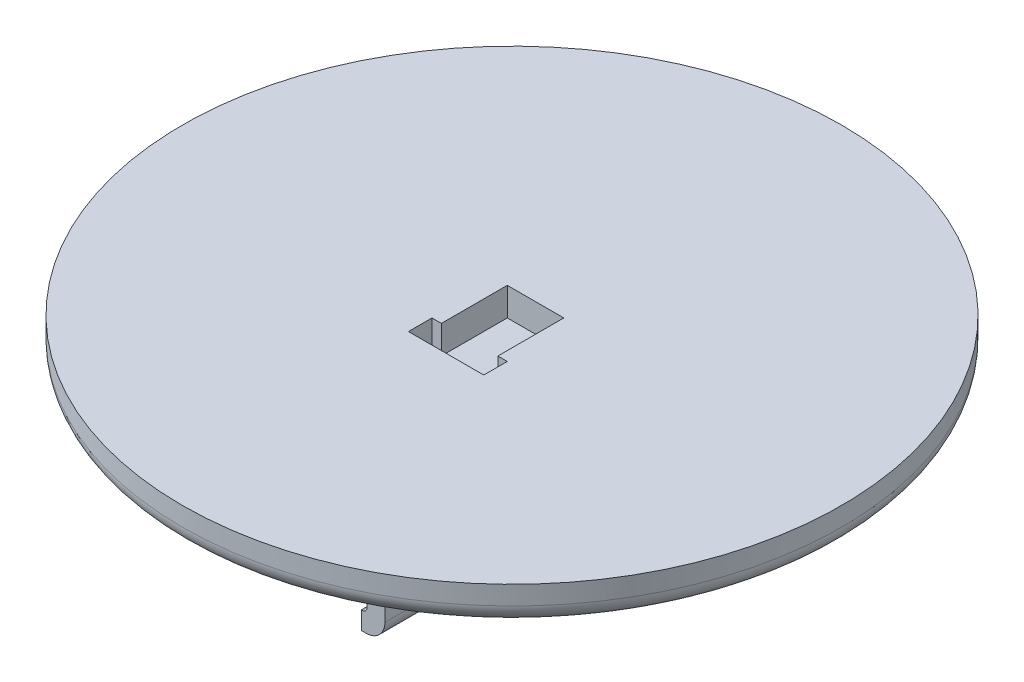
ISO-10303-21;
HEADER;
FILE_DESCRIPTION(('STEP AP214'),'2;1');
FILE_NAME('part.step','',(''),(''),'','','');
FILE_SCHEMA(('AUTOMOTIVE_DESIGN { 1 0 10303 214 1 1 1 1 }'));
ENDSEC;
DATA;
#1=APPLICATION_CONTEXT('core data for automotive mechanical design processes');
#2=APPLICATION_PROTOCOL_DEFINITION('international standard','automotive_design',2000,#1);
#3=PRODUCT_CONTEXT('',#1,'mechanical');
#4=PRODUCT('Part','Part','',(#3));
#5=PRODUCT_RELATED_PRODUCT_CATEGORY('part','',(#4));
#6=PRODUCT_DEFINITION_FORMATION('','',#4);
#7=PRODUCT_DEFINITION_CONTEXT('part definition',#1,'design');
#8=PRODUCT_DEFINITION('design','',#6,#7);
#9=PRODUCT_DEFINITION_SHAPE('','',#8);
#10=(LENGTH_UNIT() NAMED_UNIT(*) SI_UNIT(.MILLI.,.METRE.));
#11=(NAMED_UNIT(*) PLANE_ANGLE_UNIT() SI_UNIT($,.RADIAN.));
#12=(NAMED_UNIT(*) SI_UNIT($,.STERADIAN.) SOLID_ANGLE_UNIT());
#13=UNCERTAINTY_MEASURE_WITH_UNIT(LENGTH_MEASURE(1.E-05),#10,'distance_accuracy_value','');
#14=(GEOMETRIC_REPRESENTATION_CONTEXT(3) GLOBAL_UNCERTAINTY_ASSIGNED_CONTEXT((#13)) GLOBAL_UNIT_ASSIGNED_CONTEXT((#10,
#11,#12)) REPRESENTATION_CONTEXT('',''));
#15=CARTESIAN_POINT('',(0.,0.,0.));
#16=DIRECTION('',(0.,0.,1.));
#17=DIRECTION('',(1.,0.,0.));
#18=AXIS2_PLACEMENT_3D('',#15,#16,#17);
#19=CARTESIAN_POINT('',(-7.5,-12.,21.));
#20=DIRECTION('',(0.,0.,-1.));
#21=DIRECTION('',(-1.,0.,0.));
#22=AXIS2_PLACEMENT_3D('',#19,#20,#21);
#23=PLANE('',#22);
#24=DIRECTION('',(-1.,0.,0.));
#25=VECTOR('',#24,1.);
#26=CARTESIAN_POINT('',(-7.5,-12.,21.));
#27=LINE('',#26,#25);
#28=CARTESIAN_POINT('',(-5.,-12.,21.));
#29=VERTEX_POINT('',#28);
#30=CARTESIAN_POINT('',(-5.5,-12.,21.));
#31=VERTEX_POINT('',#30);
#32=EDGE_CURVE('E238',#29,#31,#27,.T.);
#33=ORIENTED_EDGE('',*,*,#32,.F.);
#34=DIRECTION('',(0.,-1.,0.));
#35=VECTOR('',#34,1.);
#36=CARTESIAN_POINT('',(-5.,-10.1,21.));
#37=LINE('',#36,#35);
#38=CARTESIAN_POINT('',(-5.,-10.1,21.));
#39=VERTEX_POINT('',#38);
#40=EDGE_CURVE('E225',#39,#29,#37,.T.);
#41=ORIENTED_EDGE('',*,*,#40,.F.);
#42=DIRECTION('',(1.,0.,0.));
#43=VECTOR('',#42,1.);
#44=CARTESIAN_POINT('',(-5.6,-10.1,21.));
#45=LINE('',#44,#43);
#46=CARTESIAN_POINT('',(-5.1,-10.1,21.));
#47=VERTEX_POINT('',#46);
#48=EDGE_CURVE('E451',#47,#39,#45,.T.);
#49=ORIENTED_EDGE('',*,*,#48,.F.);
#50=CARTESIAN_POINT('',(-5.1,-9.6,21.));
#51=DIRECTION('',(0.,0.,-1.));
#52=DIRECTION('',(-1.,0.,0.));
#53=AXIS2_PLACEMENT_3D('',#50,#51,#52);
#54=CIRCLE('',#53,0.5);
#55=CARTESIAN_POINT('',(-5.6,-9.6,21.));
#56=VERTEX_POINT('',#55);
#57=EDGE_CURVE('E12',#47,#56,#54,.T.);
#58=ORIENTED_EDGE('',*,*,#57,.T.);
#59=DIRECTION('',(0.,-1.,0.));
#60=VECTOR('',#59,1.);
#61=CARTESIAN_POINT('',(-5.6,0.,21.));
#62=LINE('',#61,#60);
#63=CARTESIAN_POINT('',(-5.6,0.,21.));
#64=VERTEX_POINT('',#63);
#65=EDGE_CURVE('E422',#64,#56,#62,.T.);
#66=ORIENTED_EDGE('',*,*,#65,.F.);
#67=DIRECTION('',(-1.,0.,0.));
#68=VECTOR('',#67,1.);
#69=CARTESIAN_POINT('',(-7.5,0.,21.));
#70=LINE('',#69,#68);
#71=CARTESIAN_POINT('',(-9.5,0.,21.));
#72=VERTEX_POINT('',#71);
#73=EDGE_CURVE('E254',#64,#72,#70,.T.);
#74=ORIENTED_EDGE('',*,*,#73,.T.);
#75=CARTESIAN_POINT('',(-9.5,-2.,21.));
#76=DIRECTION('',(0.,0.,-1.));
#77=DIRECTION('',(-1.,0.,0.));
#78=AXIS2_PLACEMENT_3D('',#75,#76,#77);
#79=CIRCLE('',#78,2.);
#80=CARTESIAN_POINT('',(-7.5,-2.,21.));
#81=VERTEX_POINT('',#80);
#82=EDGE_CURVE('E381',#72,#81,#79,.T.);
#83=ORIENTED_EDGE('',*,*,#82,.T.);
#84=DIRECTION('',(0.,1.,0.));
#85=VECTOR('',#84,1.);
#86=CARTESIAN_POINT('',(-7.5,-12.,21.));
#87=LINE('',#86,#85);
#88=CARTESIAN_POINT('',(-7.5,-10.,21.));
#89=VERTEX_POINT('',#88);
#90=EDGE_CURVE('E252',#89,#81,#87,.T.);
#91=ORIENTED_EDGE('',*,*,#90,.F.);
#92=CARTESIAN_POINT('',(-5.5,-10.,21.));
#93=DIRECTION('',(0.,0.,-1.));
#94=DIRECTION('',(-1.,0.,0.));
#95=AXIS2_PLACEMENT_3D('',#92,#93,#94);
#96=CIRCLE('',#95,2.);
#97=EDGE_CURVE('E246',#89,#31,#96,.F.);
#98=ORIENTED_EDGE('',*,*,#97,.T.);
#99=EDGE_LOOP('',(#33,#41,#49,#58,#66,#74,#83,#91,#98));
#100=FACE_BOUND('',#99,.T.);
#101=ADVANCED_FACE('F35',(#100),#23,.F.);
#102=CARTESIAN_POINT('',(0.,-12.,0.));
#103=DIRECTION('',(0.,-1.,0.));
#104=DIRECTION('',(0.,0.,-1.));
#105=AXIS2_PLACEMENT_3D('',#102,#103,#104);
#106=PLANE('',#105);
#107=DIRECTION('',(0.,0.,1.));
#108=VECTOR('',#107,1.);
#109=CARTESIAN_POINT('',(-5.,-12.,-11.1788997440784));
#110=LINE('',#109,#108);
#111=CARTESIAN_POINT('',(-5.,-12.,-1.));
#112=VERTEX_POINT('',#111);
#113=EDGE_CURVE('E228',#112,#29,#110,.T.);
#114=ORIENTED_EDGE('',*,*,#113,.T.);
#115=ORIENTED_EDGE('',*,*,#32,.T.);
#116=DIRECTION('',(0.,0.,-1.));
#117=VECTOR('',#116,1.);
#118=CARTESIAN_POINT('',(-5.5,-12.,-3.));
#119=LINE('',#118,#117);
#120=CARTESIAN_POINT('',(-5.5,-12.,-1.));
#121=VERTEX_POINT('',#120);
#122=EDGE_CURVE('E372',#31,#121,#119,.T.);
#123=ORIENTED_EDGE('',*,*,#122,.T.);
#124=DIRECTION('',(1.,0.,0.));
#125=VECTOR('',#124,1.);
#126=CARTESIAN_POINT('',(7.5,-12.,-0.999999999999998));
#127=LINE('',#126,#125);
#128=EDGE_CURVE('E241',#121,#112,#127,.T.);
#129=ORIENTED_EDGE('',*,*,#128,.T.);
#130=EDGE_LOOP('',(#114,#115,#123,#129));
#131=FACE_BOUND('',#130,.T.);
#132=ADVANCED_FACE('F237',(#131),#106,.T.);
#133=CARTESIAN_POINT('',(-5.6,-10.1,-18.0814455540575));
#134=DIRECTION('',(0.,-1.,0.));
#135=DIRECTION('',(0.,0.,-1.));
#136=AXIS2_PLACEMENT_3D('',#133,#134,#135);
#137=PLANE('',#136);
#138=DIRECTION('',(-1.,0.,0.));
#139=VECTOR('',#138,1.);
#140=CARTESIAN_POINT('',(-5.6,-10.1,-1.));
#141=LINE('',#140,#139);
#142=CARTESIAN_POINT('',(-5.,-10.1,-1.));
#143=VERTEX_POINT('',#142);
#144=CARTESIAN_POINT('',(-5.1,-10.1,-1.));
#145=VERTEX_POINT('',#144);
#146=EDGE_CURVE('E476',#143,#145,#141,.T.);
#147=ORIENTED_EDGE('',*,*,#146,.T.);
#148=DIRECTION('',(0.,0.,1.));
#149=VECTOR('',#148,1.);
#150=CARTESIAN_POINT('',(-5.1,-10.1,21.));
#151=LINE('',#150,#149);
#152=EDGE_CURVE('E431',#145,#47,#151,.T.);
#153=ORIENTED_EDGE('',*,*,#152,.T.);
#154=ORIENTED_EDGE('',*,*,#48,.T.);
#155=DIRECTION('',(0.,0.,1.));
#156=VECTOR('',#155,1.);
#157=CARTESIAN_POINT('',(-5.,-10.1,-11.1788997440784));
#158=LINE('',#157,#156);
#159=EDGE_CURVE('E231',#143,#39,#158,.T.);
#160=ORIENTED_EDGE('',*,*,#159,.F.);
#161=EDGE_LOOP('',(#147,#153,#154,#160));
#162=FACE_BOUND('',#161,.T.);
#163=ADVANCED_FACE('F572',(#162),#137,.F.);
#164=CARTESIAN_POINT('',(0.,0.,0.));
#165=DIRECTION('',(0.,1.,0.));
#166=DIRECTION('',(0.,0.,1.));
#167=AXIS2_PLACEMENT_3D('',#164,#165,#166);
#168=PLANE('',#167);
#169=CARTESIAN_POINT('',(0.,0.,0.));
#170=DIRECTION('',(0.,1.,0.));
#171=DIRECTION('',(0.,0.,1.));
#172=AXIS2_PLACEMENT_3D('',#169,#170,#171);
#173=CIRCLE('',#172,33.);
#174=CARTESIAN_POINT('',(0.,0.,33.));
#175=VERTEX_POINT('',#174);
#176=EDGE_CURVE('E334',#175,#175,#173,.F.);
#177=ORIENTED_EDGE('',*,*,#176,.T.);
#178=EDGE_LOOP('',(#177));
#179=FACE_BOUND('',#178,.T.);
#180=DIRECTION('',(0.,0.,-1.));
#181=VECTOR('',#180,1.);
#182=CARTESIAN_POINT('',(-9.5,0.,21.));
#183=LINE('',#182,#181);
#184=CARTESIAN_POINT('',(-9.5,0.,-1.));
#185=VERTEX_POINT('',#184);
#186=EDGE_CURVE('E354',#185,#72,#183,.F.);
#187=ORIENTED_EDGE('',*,*,#186,.T.);
#188=ORIENTED_EDGE('',*,*,#73,.F.);
#189=DIRECTION('',(0.,0.,1.));
#190=VECTOR('',#189,1.);
#191=CARTESIAN_POINT('',(-5.6,0.,-18.0814455540575));
#192=LINE('',#191,#190);
#193=CARTESIAN_POINT('',(-5.6,0.,-1.));
#194=VERTEX_POINT('',#193);
#195=EDGE_CURVE('E468',#194,#64,#192,.T.);
#196=ORIENTED_EDGE('',*,*,#195,.F.);
#197=DIRECTION('',(1.,0.,0.));
#198=VECTOR('',#197,1.);
#199=CARTESIAN_POINT('',(-5.6,0.,-1.));
#200=LINE('',#199,#198);
#201=CARTESIAN_POINT('',(5.59999999999999,0.,-1.));
#202=VERTEX_POINT('',#201);
#203=EDGE_CURVE('E467',#194,#202,#200,.T.);
#204=ORIENTED_EDGE('',*,*,#203,.T.);
#205=DIRECTION('',(0.,0.,1.));
#206=VECTOR('',#205,1.);
#207=CARTESIAN_POINT('',(5.59999999999999,0.,-18.0814455540575));
#208=LINE('',#207,#206);
#209=CARTESIAN_POINT('',(5.59999999999999,0.,21.));
#210=VERTEX_POINT('',#209);
#211=EDGE_CURVE('E466',#202,#210,#208,.T.);
#212=ORIENTED_EDGE('',*,*,#211,.T.);
#213=CARTESIAN_POINT('',(9.5,0.,21.));
#214=VERTEX_POINT('',#213);
#215=EDGE_CURVE('E249',#214,#210,#70,.T.);
#216=ORIENTED_EDGE('',*,*,#215,.F.);
#217=DIRECTION('',(0.,0.,1.));
#218=VECTOR('',#217,1.);
#219=CARTESIAN_POINT('',(9.5,0.,-3.));
#220=LINE('',#219,#218);
#221=CARTESIAN_POINT('',(9.5,0.,-1.));
#222=VERTEX_POINT('',#221);
#223=EDGE_CURVE('E352',#214,#222,#220,.F.);
#224=ORIENTED_EDGE('',*,*,#223,.T.);
#225=CARTESIAN_POINT('',(5.5,0.,-1.));
#226=DIRECTION('',(0.,1.,0.));
#227=DIRECTION('',(0.,0.,1.));
#228=AXIS2_PLACEMENT_3D('',#225,#226,#227);
#229=CIRCLE('',#228,4.);
#230=CARTESIAN_POINT('',(5.5,0.,-5.));
#231=VERTEX_POINT('',#230);
#232=EDGE_CURVE('E349',#231,#222,#229,.F.);
#233=ORIENTED_EDGE('',*,*,#232,.F.);
#234=DIRECTION('',(1.,0.,0.));
#235=VECTOR('',#234,1.);
#236=CARTESIAN_POINT('',(-7.5,0.,-5.));
#237=LINE('',#236,#235);
#238=CARTESIAN_POINT('',(-5.5,0.,-5.));
#239=VERTEX_POINT('',#238);
#240=EDGE_CURVE('E347',#231,#239,#237,.F.);
#241=ORIENTED_EDGE('',*,*,#240,.T.);
#242=CARTESIAN_POINT('',(-5.5,0.,-1.));
#243=DIRECTION('',(0.,1.,0.));
#244=DIRECTION('',(0.,0.,1.));
#245=AXIS2_PLACEMENT_3D('',#242,#243,#244);
#246=CIRCLE('',#245,4.);
#247=EDGE_CURVE('E344',#185,#239,#246,.F.);
#248=ORIENTED_EDGE('',*,*,#247,.F.);
#249=EDGE_LOOP('',(#187,#188,#196,#204,#212,#216,#224,#233,#241,#248));
#250=FACE_BOUND('',#249,.T.);
#251=DIRECTION('',(0.,0.,-1.));
#252=VECTOR('',#251,1.);
#253=CARTESIAN_POINT('',(-4.,0.,4.5));
#254=LINE('',#253,#252);
#255=CARTESIAN_POINT('',(-4.,0.,7.));
#256=VERTEX_POINT('',#255);
#257=CARTESIAN_POINT('',(-4.,0.,4.5));
#258=VERTEX_POINT('',#257);
#259=EDGE_CURVE('E273',#256,#258,#254,.T.);
#260=ORIENTED_EDGE('',*,*,#259,.F.);
#261=DIRECTION('',(-1.,0.,0.));
#262=VECTOR('',#261,1.);
#263=CARTESIAN_POINT('',(-4.,0.,7.));
#264=LINE('',#263,#262);
#265=CARTESIAN_POINT('',(4.,0.,7.));
#266=VERTEX_POINT('',#265);
#267=EDGE_CURVE('E276',#266,#256,#264,.T.);
#268=ORIENTED_EDGE('',*,*,#267,.F.);
#269=DIRECTION('',(0.,0.,1.));
#270=VECTOR('',#269,1.);
#271=CARTESIAN_POINT('',(4.,0.,4.5));
#272=LINE('',#271,#270);
#273=CARTESIAN_POINT('',(4.,0.,4.5));
#274=VERTEX_POINT('',#273);
#275=EDGE_CURVE('E266',#274,#266,#272,.T.);
#276=ORIENTED_EDGE('',*,*,#275,.F.);
#277=DIRECTION('',(1.,0.,0.));
#278=VECTOR('',#277,1.);
#279=CARTESIAN_POINT('',(-4.,0.,4.5));
#280=LINE('',#279,#278);
#281=EDGE_CURVE('E269',#258,#274,#280,.T.);
#282=ORIENTED_EDGE('',*,*,#281,.F.);
#283=EDGE_LOOP('',(#260,#268,#276,#282));
#284=FACE_BOUND('',#283,.T.);
#285=ADVANCED_FACE('F479',(#179,#250,#284),#168,.F.);
#286=CARTESIAN_POINT('',(0.,4.,0.));
#287=DIRECTION('',(0.,-1.,0.));
#288=DIRECTION('',(0.,0.,-1.));
#289=AXIS2_PLACEMENT_3D('',#286,#287,#288);
#290=CYLINDRICAL_SURFACE('',#289,35.);
#291=CARTESIAN_POINT('',(0.,2.,0.));
#292=DIRECTION('',(0.,1.,0.));
#293=DIRECTION('',(0.,0.,1.));
#294=AXIS2_PLACEMENT_3D('',#291,#292,#293);
#295=CIRCLE('',#294,35.);
#296=CARTESIAN_POINT('',(0.,2.,35.));
#297=VERTEX_POINT('',#296);
#298=EDGE_CURVE('E331',#297,#297,#295,.T.);
#299=ORIENTED_EDGE('',*,*,#298,.T.);
#300=EDGE_LOOP('',(#299));
#301=FACE_BOUND('',#300,.T.);
#302=CARTESIAN_POINT('',(0.,4.,0.));
#303=DIRECTION('',(0.,1.,0.));
#304=DIRECTION('',(0.,0.,1.));
#305=AXIS2_PLACEMENT_3D('',#302,#303,#304);
#306=CIRCLE('',#305,35.);
#307=CARTESIAN_POINT('',(0.,4.,35.));
#308=VERTEX_POINT('',#307);
#309=EDGE_CURVE('E322',#308,#308,#306,.T.);
#310=ORIENTED_EDGE('',*,*,#309,.F.);
#311=EDGE_LOOP('',(#310));
#312=FACE_BOUND('',#311,.T.);
#313=ADVANCED_FACE('F626',(#301,#312),#290,.T.);
#314=CARTESIAN_POINT('',(0.,4.,0.));
#315=DIRECTION('',(0.,1.,0.));
#316=DIRECTION('',(0.,0.,1.));
#317=AXIS2_PLACEMENT_3D('',#314,#315,#316);
#318=PLANE('',#317);
#319=DIRECTION('',(-1.,0.,0.));
#320=VECTOR('',#319,1.);
#321=CARTESIAN_POINT('',(-4.,4.,4.5));
#322=LINE('',#321,#320);
#323=CARTESIAN_POINT('',(-3.,4.,4.5));
#324=VERTEX_POINT('',#323);
#325=CARTESIAN_POINT('',(-4.,4.,4.5));
#326=VERTEX_POINT('',#325);
#327=EDGE_CURVE('E285',#324,#326,#322,.T.);
#328=ORIENTED_EDGE('',*,*,#327,.F.);
#329=DIRECTION('',(0.,0.,1.));
#330=VECTOR('',#329,1.);
#331=CARTESIAN_POINT('',(-3.,4.,-2.5));
#332=LINE('',#331,#330);
#333=CARTESIAN_POINT('',(-3.,4.,-2.5));
#334=VERTEX_POINT('',#333);
#335=EDGE_CURVE('E298',#334,#324,#332,.T.);
#336=ORIENTED_EDGE('',*,*,#335,.F.);
#337=DIRECTION('',(-1.,0.,0.));
#338=VECTOR('',#337,1.);
#339=CARTESIAN_POINT('',(-3.,4.,-2.5));
#340=LINE('',#339,#338);
#341=CARTESIAN_POINT('',(3.,4.,-2.5));
#342=VERTEX_POINT('',#341);
#343=EDGE_CURVE('E303',#342,#334,#340,.T.);
#344=ORIENTED_EDGE('',*,*,#343,.F.);
#345=DIRECTION('',(0.,0.,-1.));
#346=VECTOR('',#345,1.);
#347=CARTESIAN_POINT('',(3.,4.,-2.5));
#348=LINE('',#347,#346);
#349=CARTESIAN_POINT('',(3.,4.,4.5));
#350=VERTEX_POINT('',#349);
#351=EDGE_CURVE('E315',#350,#342,#348,.T.);
#352=ORIENTED_EDGE('',*,*,#351,.F.);
#353=CARTESIAN_POINT('',(4.,4.,4.5));
#354=VERTEX_POINT('',#353);
#355=EDGE_CURVE('E286',#354,#350,#322,.T.);
#356=ORIENTED_EDGE('',*,*,#355,.F.);
#357=DIRECTION('',(0.,0.,-1.));
#358=VECTOR('',#357,1.);
#359=CARTESIAN_POINT('',(4.,4.,4.5));
#360=LINE('',#359,#358);
#361=CARTESIAN_POINT('',(4.,4.,7.));
#362=VERTEX_POINT('',#361);
#363=EDGE_CURVE('E282',#362,#354,#360,.T.);
#364=ORIENTED_EDGE('',*,*,#363,.F.);
#365=DIRECTION('',(1.,0.,0.));
#366=VECTOR('',#365,1.);
#367=CARTESIAN_POINT('',(-4.,4.,7.));
#368=LINE('',#367,#366);
#369=CARTESIAN_POINT('',(-4.,4.,7.));
#370=VERTEX_POINT('',#369);
#371=EDGE_CURVE('E279',#370,#362,#368,.T.);
#372=ORIENTED_EDGE('',*,*,#371,.F.);
#373=DIRECTION('',(0.,0.,1.));
#374=VECTOR('',#373,1.);
#375=CARTESIAN_POINT('',(-4.,4.,4.5));
#376=LINE('',#375,#374);
#377=EDGE_CURVE('E265',#326,#370,#376,.T.);
#378=ORIENTED_EDGE('',*,*,#377,.F.);
#379=EDGE_LOOP('',(#328,#336,#344,#352,#356,#364,#372,#378));
#380=FACE_BOUND('',#379,.T.);
#381=ORIENTED_EDGE('',*,*,#309,.T.);
#382=EDGE_LOOP('',(#381));
#383=FACE_BOUND('',#382,.T.);
#384=ADVANCED_FACE('F624',(#380,#383),#318,.T.);
#385=CARTESIAN_POINT('',(0.,2.,0.));
#386=DIRECTION('',(0.,1.,0.));
#387=DIRECTION('',(0.,0.,1.));
#388=AXIS2_PLACEMENT_3D('',#385,#386,#387);
#389=TOROIDAL_SURFACE('',#388,33.,2.);
#390=ORIENTED_EDGE('',*,*,#176,.F.);
#391=EDGE_LOOP('',(#390));
#392=FACE_BOUND('',#391,.T.);
#393=ORIENTED_EDGE('',*,*,#298,.F.);
#394=EDGE_LOOP('',(#393));
#395=FACE_BOUND('',#394,.T.);
#396=ADVANCED_FACE('F620',(#392,#395),#389,.T.);
#397=CARTESIAN_POINT('',(-3.,1.,-2.5));
#398=DIRECTION('',(-1.,0.,0.));
#399=DIRECTION('',(0.,0.,1.));
#400=AXIS2_PLACEMENT_3D('',#397,#398,#399);
#401=PLANE('',#400);
#402=ORIENTED_EDGE('',*,*,#335,.T.);
#403=DIRECTION('',(0.,1.,0.));
#404=VECTOR('',#403,1.);
#405=CARTESIAN_POINT('',(-3.,1.,4.5));
#406=LINE('',#405,#404);
#407=CARTESIAN_POINT('',(-3.,1.,4.5));
#408=VERTEX_POINT('',#407);
#409=EDGE_CURVE('E312',#408,#324,#406,.T.);
#410=ORIENTED_EDGE('',*,*,#409,.F.);
#411=DIRECTION('',(0.,0.,1.));
#412=VECTOR('',#411,1.);
#413=CARTESIAN_POINT('',(-3.,1.,-2.5));
#414=LINE('',#413,#412);
#415=CARTESIAN_POINT('',(-3.,1.,-2.5));
#416=VERTEX_POINT('',#415);
#417=EDGE_CURVE('E299',#416,#408,#414,.T.);
#418=ORIENTED_EDGE('',*,*,#417,.F.);
#419=DIRECTION('',(0.,1.,0.));
#420=VECTOR('',#419,1.);
#421=CARTESIAN_POINT('',(-3.,1.,-2.5));
#422=LINE('',#421,#420);
#423=EDGE_CURVE('E320',#416,#334,#422,.T.);
#424=ORIENTED_EDGE('',*,*,#423,.T.);
#425=EDGE_LOOP('',(#402,#410,#418,#424));
#426=FACE_BOUND('',#425,.T.);
#427=ADVANCED_FACE('F623',(#426),#401,.F.);
#428=CARTESIAN_POINT('',(-3.,1.,-2.5));
#429=DIRECTION('',(0.,0.,-1.));
#430=DIRECTION('',(-1.,0.,0.));
#431=AXIS2_PLACEMENT_3D('',#428,#429,#430);
#432=PLANE('',#431);
#433=ORIENTED_EDGE('',*,*,#343,.T.);
#434=ORIENTED_EDGE('',*,*,#423,.F.);
#435=DIRECTION('',(-1.,0.,0.));
#436=VECTOR('',#435,1.);
#437=CARTESIAN_POINT('',(-3.,1.,-2.5));
#438=LINE('',#437,#436);
#439=CARTESIAN_POINT('',(3.,1.,-2.5));
#440=VERTEX_POINT('',#439);
#441=EDGE_CURVE('E309',#440,#416,#438,.T.);
#442=ORIENTED_EDGE('',*,*,#441,.F.);
#443=DIRECTION('',(0.,1.,0.));
#444=VECTOR('',#443,1.);
#445=CARTESIAN_POINT('',(3.,1.,-2.5));
#446=LINE('',#445,#444);
#447=EDGE_CURVE('E323',#440,#342,#446,.T.);
#448=ORIENTED_EDGE('',*,*,#447,.T.);
#449=EDGE_LOOP('',(#433,#434,#442,#448));
#450=FACE_BOUND('',#449,.T.);
#451=ADVANCED_FACE('F638',(#450),#432,.F.);
#452=CARTESIAN_POINT('',(3.,1.,-2.5));
#453=DIRECTION('',(1.,0.,0.));
#454=DIRECTION('',(0.,0.,-1.));
#455=AXIS2_PLACEMENT_3D('',#452,#453,#454);
#456=PLANE('',#455);
#457=ORIENTED_EDGE('',*,*,#351,.T.);
#458=ORIENTED_EDGE('',*,*,#447,.F.);
#459=DIRECTION('',(0.,0.,-1.));
#460=VECTOR('',#459,1.);
#461=CARTESIAN_POINT('',(3.,1.,-2.5));
#462=LINE('',#461,#460);
#463=CARTESIAN_POINT('',(3.,1.,4.5));
#464=VERTEX_POINT('',#463);
#465=EDGE_CURVE('E306',#464,#440,#462,.T.);
#466=ORIENTED_EDGE('',*,*,#465,.F.);
#467=DIRECTION('',(0.,1.,0.));
#468=VECTOR('',#467,1.);
#469=CARTESIAN_POINT('',(3.,1.,4.5));
#470=LINE('',#469,#468);
#471=EDGE_CURVE('E325',#464,#350,#470,.T.);
#472=ORIENTED_EDGE('',*,*,#471,.T.);
#473=EDGE_LOOP('',(#457,#458,#466,#472));
#474=FACE_BOUND('',#473,.T.);
#475=ADVANCED_FACE('F640',(#474),#456,.F.);
#476=CARTESIAN_POINT('',(0.,1.,0.));
#477=DIRECTION('',(0.,1.,0.));
#478=DIRECTION('',(0.,0.,1.));
#479=AXIS2_PLACEMENT_3D('',#476,#477,#478);
#480=PLANE('',#479);
#481=ORIENTED_EDGE('',*,*,#417,.T.);
#482=DIRECTION('',(1.,0.,0.));
#483=VECTOR('',#482,1.);
#484=CARTESIAN_POINT('',(-3.,1.,4.5));
#485=LINE('',#484,#483);
#486=EDGE_CURVE('E302',#408,#464,#485,.T.);
#487=ORIENTED_EDGE('',*,*,#486,.T.);
#488=ORIENTED_EDGE('',*,*,#465,.T.);
#489=ORIENTED_EDGE('',*,*,#441,.T.);
#490=EDGE_LOOP('',(#481,#487,#488,#489));
#491=FACE_BOUND('',#490,.T.);
#492=ADVANCED_FACE('F643',(#491),#480,.T.);
#493=CARTESIAN_POINT('',(-4.,-8.38152730712011,4.5));
#494=DIRECTION('',(0.,0.,-1.));
#495=DIRECTION('',(-1.,0.,0.));
#496=AXIS2_PLACEMENT_3D('',#493,#494,#495);
#497=PLANE('',#496);
#498=ORIENTED_EDGE('',*,*,#327,.T.);
#499=DIRECTION('',(0.,1.,0.));
#500=VECTOR('',#499,1.);
#501=CARTESIAN_POINT('',(-4.,-8.38152730712011,4.5));
#502=LINE('',#501,#500);
#503=EDGE_CURVE('E270',#258,#326,#502,.T.);
#504=ORIENTED_EDGE('',*,*,#503,.F.);
#505=ORIENTED_EDGE('',*,*,#281,.T.);
#506=DIRECTION('',(0.,1.,0.));
#507=VECTOR('',#506,1.);
#508=CARTESIAN_POINT('',(4.,-8.38152730712011,4.5));
#509=LINE('',#508,#507);
#510=EDGE_CURVE('E291',#274,#354,#509,.T.);
#511=ORIENTED_EDGE('',*,*,#510,.T.);
#512=ORIENTED_EDGE('',*,*,#355,.T.);
#513=ORIENTED_EDGE('',*,*,#471,.F.);
#514=ORIENTED_EDGE('',*,*,#486,.F.);
#515=ORIENTED_EDGE('',*,*,#409,.T.);
#516=EDGE_LOOP('',(#498,#504,#505,#511,#512,#513,#514,#515));
#517=FACE_BOUND('',#516,.T.);
#518=ADVANCED_FACE('F650',(#517),#497,.F.);
#519=CARTESIAN_POINT('',(-4.,-8.38152730712011,4.5));
#520=DIRECTION('',(-1.,0.,0.));
#521=DIRECTION('',(0.,0.,1.));
#522=AXIS2_PLACEMENT_3D('',#519,#520,#521);
#523=PLANE('',#522);
#524=ORIENTED_EDGE('',*,*,#259,.T.);
#525=ORIENTED_EDGE('',*,*,#503,.T.);
#526=ORIENTED_EDGE('',*,*,#377,.T.);
#527=DIRECTION('',(0.,1.,0.));
#528=VECTOR('',#527,1.);
#529=CARTESIAN_POINT('',(-4.,-8.38152730712011,7.));
#530=LINE('',#529,#528);
#531=EDGE_CURVE('E288',#256,#370,#530,.T.);
#532=ORIENTED_EDGE('',*,*,#531,.F.);
#533=EDGE_LOOP('',(#524,#525,#526,#532));
#534=FACE_BOUND('',#533,.T.);
#535=ADVANCED_FACE('F652',(#534),#523,.F.);
#536=CARTESIAN_POINT('',(4.,-8.38152730712011,4.5));
#537=DIRECTION('',(1.,0.,0.));
#538=DIRECTION('',(0.,0.,-1.));
#539=AXIS2_PLACEMENT_3D('',#536,#537,#538);
#540=PLANE('',#539);
#541=ORIENTED_EDGE('',*,*,#275,.T.);
#542=DIRECTION('',(0.,1.,0.));
#543=VECTOR('',#542,1.);
#544=CARTESIAN_POINT('',(4.,-8.38152730712011,7.));
#545=LINE('',#544,#543);
#546=EDGE_CURVE('E293',#266,#362,#545,.T.);
#547=ORIENTED_EDGE('',*,*,#546,.T.);
#548=ORIENTED_EDGE('',*,*,#363,.T.);
#549=ORIENTED_EDGE('',*,*,#510,.F.);
#550=EDGE_LOOP('',(#541,#547,#548,#549));
#551=FACE_BOUND('',#550,.T.);
#552=ADVANCED_FACE('F655',(#551),#540,.F.);
#553=CARTESIAN_POINT('',(-4.,-8.38152730712011,7.));
#554=DIRECTION('',(0.,0.,1.));
#555=DIRECTION('',(1.,0.,0.));
#556=AXIS2_PLACEMENT_3D('',#553,#554,#555);
#557=PLANE('',#556);
#558=ORIENTED_EDGE('',*,*,#267,.T.);
#559=ORIENTED_EDGE('',*,*,#531,.T.);
#560=ORIENTED_EDGE('',*,*,#371,.T.);
#561=ORIENTED_EDGE('',*,*,#546,.F.);
#562=EDGE_LOOP('',(#558,#559,#560,#561));
#563=FACE_BOUND('',#562,.T.);
#564=ADVANCED_FACE('F657',(#563),#557,.F.);
#565=CARTESIAN_POINT('',(-7.5,-12.,21.));
#566=DIRECTION('',(1.,0.,0.));
#567=DIRECTION('',(0.,0.,-1.));
#568=AXIS2_PLACEMENT_3D('',#565,#566,#567);
#569=PLANE('',#568);
#570=ORIENTED_EDGE('',*,*,#90,.T.);
#571=DIRECTION('',(0.,0.,-1.));
#572=VECTOR('',#571,1.);
#573=CARTESIAN_POINT('',(-7.5,-2.,-3.));
#574=LINE('',#573,#572);
#575=CARTESIAN_POINT('',(-7.5,-2.,-1.));
#576=VERTEX_POINT('',#575);
#577=EDGE_CURVE('E341',#81,#576,#574,.T.);
#578=ORIENTED_EDGE('',*,*,#577,.T.);
#579=DIRECTION('',(0.,1.,0.));
#580=VECTOR('',#579,1.);
#581=CARTESIAN_POINT('',(-7.5,-12.,-1.));
#582=LINE('',#581,#580);
#583=CARTESIAN_POINT('',(-7.5,-10.,-1.));
#584=VERTEX_POINT('',#583);
#585=EDGE_CURVE('E339',#576,#584,#582,.F.);
#586=ORIENTED_EDGE('',*,*,#585,.T.);
#587=DIRECTION('',(0.,0.,-1.));
#588=VECTOR('',#587,1.);
#589=CARTESIAN_POINT('',(-7.5,-10.,21.));
#590=LINE('',#589,#588);
#591=EDGE_CURVE('E337',#584,#89,#590,.F.);
#592=ORIENTED_EDGE('',*,*,#591,.T.);
#593=EDGE_LOOP('',(#570,#578,#586,#592));
#594=FACE_BOUND('',#593,.T.);
#595=ADVANCED_FACE('F509',(#594),#569,.F.);
#596=CARTESIAN_POINT('',(-7.5,-12.,-3.));
#597=DIRECTION('',(0.,0.,1.));
#598=DIRECTION('',(1.,0.,0.));
#599=AXIS2_PLACEMENT_3D('',#596,#597,#598);
#600=PLANE('',#599);
#601=DIRECTION('',(1.,0.,0.));
#602=VECTOR('',#601,1.);
#603=CARTESIAN_POINT('',(-7.5,-10.,-3.));
#604=LINE('',#603,#602);
#605=CARTESIAN_POINT('',(5.5,-10.,-3.));
#606=VERTEX_POINT('',#605);
#607=CARTESIAN_POINT('',(-5.5,-10.,-3.));
#608=VERTEX_POINT('',#607);
#609=EDGE_CURVE('E367',#606,#608,#604,.F.);
#610=ORIENTED_EDGE('',*,*,#609,.T.);
#611=DIRECTION('',(0.,1.,0.));
#612=VECTOR('',#611,1.);
#613=CARTESIAN_POINT('',(-5.5,-12.,-3.));
#614=LINE('',#613,#612);
#615=CARTESIAN_POINT('',(-5.5,-2.,-3.));
#616=VERTEX_POINT('',#615);
#617=EDGE_CURVE('E369',#608,#616,#614,.T.);
#618=ORIENTED_EDGE('',*,*,#617,.T.);
#619=DIRECTION('',(1.,0.,0.));
#620=VECTOR('',#619,1.);
#621=CARTESIAN_POINT('',(7.5,-2.,-3.));
#622=LINE('',#621,#620);
#623=CARTESIAN_POINT('',(5.5,-2.,-3.));
#624=VERTEX_POINT('',#623);
#625=EDGE_CURVE('E363',#616,#624,#622,.T.);
#626=ORIENTED_EDGE('',*,*,#625,.T.);
#627=DIRECTION('',(0.,1.,0.));
#628=VECTOR('',#627,1.);
#629=CARTESIAN_POINT('',(5.5,-12.,-3.));
#630=LINE('',#629,#628);
#631=EDGE_CURVE('E365',#624,#606,#630,.F.);
#632=ORIENTED_EDGE('',*,*,#631,.T.);
#633=EDGE_LOOP('',(#610,#618,#626,#632));
#634=FACE_BOUND('',#633,.T.);
#635=ADVANCED_FACE('F523',(#634),#600,.F.);
#636=CARTESIAN_POINT('',(7.5,-12.,21.));
#637=DIRECTION('',(-1.,0.,0.));
#638=DIRECTION('',(0.,0.,1.));
#639=AXIS2_PLACEMENT_3D('',#636,#637,#638);
#640=PLANE('',#639);
#641=DIRECTION('',(0.,1.,0.));
#642=VECTOR('',#641,1.);
#643=CARTESIAN_POINT('',(7.5,-12.,-1.));
#644=LINE('',#643,#642);
#645=CARTESIAN_POINT('',(7.5,-10.,-1.));
#646=VERTEX_POINT('',#645);
#647=CARTESIAN_POINT('',(7.5,-2.,-1.));
#648=VERTEX_POINT('',#647);
#649=EDGE_CURVE('E359',#646,#648,#644,.T.);
#650=ORIENTED_EDGE('',*,*,#649,.T.);
#651=DIRECTION('',(0.,0.,1.));
#652=VECTOR('',#651,1.);
#653=CARTESIAN_POINT('',(7.5,-2.,21.));
#654=LINE('',#653,#652);
#655=CARTESIAN_POINT('',(7.5,-2.,21.));
#656=VERTEX_POINT('',#655);
#657=EDGE_CURVE('E361',#648,#656,#654,.T.);
#658=ORIENTED_EDGE('',*,*,#657,.T.);
#659=DIRECTION('',(0.,1.,0.));
#660=VECTOR('',#659,1.);
#661=CARTESIAN_POINT('',(7.5,-12.,21.));
#662=LINE('',#661,#660);
#663=CARTESIAN_POINT('',(7.5,-10.,21.));
#664=VERTEX_POINT('',#663);
#665=EDGE_CURVE('E262',#664,#656,#662,.T.);
#666=ORIENTED_EDGE('',*,*,#665,.F.);
#667=DIRECTION('',(0.,0.,1.));
#668=VECTOR('',#667,1.);
#669=CARTESIAN_POINT('',(7.5,-10.,-3.));
#670=LINE('',#669,#668);
#671=EDGE_CURVE('E357',#664,#646,#670,.F.);
#672=ORIENTED_EDGE('',*,*,#671,.T.);
#673=EDGE_LOOP('',(#650,#658,#666,#672));
#674=FACE_BOUND('',#673,.T.);
#675=ADVANCED_FACE('F559',(#674),#640,.F.);
#676=CARTESIAN_POINT('',(4.99999999999999,-10.1,21.));
#677=VERTEX_POINT('',#676);
#678=CARTESIAN_POINT('',(5.09999999999999,-10.1,21.));
#679=VERTEX_POINT('',#678);
#680=EDGE_CURVE('E440',#677,#679,#45,.T.);
#681=ORIENTED_EDGE('',*,*,#680,.F.);
#682=DIRECTION('',(0.,1.,0.));
#683=VECTOR('',#682,1.);
#684=CARTESIAN_POINT('',(4.99999999999999,-10.1,21.));
#685=LINE('',#684,#683);
#686=CARTESIAN_POINT('',(4.99999999999999,-12.,21.));
#687=VERTEX_POINT('',#686);
#688=EDGE_CURVE('E233',#687,#677,#685,.T.);
#689=ORIENTED_EDGE('',*,*,#688,.F.);
#690=CARTESIAN_POINT('',(5.49999999999999,-12.,21.));
#691=VERTEX_POINT('',#690);
#692=EDGE_CURVE('E248',#691,#687,#27,.T.);
#693=ORIENTED_EDGE('',*,*,#692,.F.);
#694=CARTESIAN_POINT('',(5.5,-10.,21.));
#695=DIRECTION('',(0.,0.,-1.));
#696=DIRECTION('',(-1.,0.,0.));
#697=AXIS2_PLACEMENT_3D('',#694,#695,#696);
#698=CIRCLE('',#697,2.);
#699=EDGE_CURVE('E379',#691,#664,#698,.F.);
#700=ORIENTED_EDGE('',*,*,#699,.T.);
#701=ORIENTED_EDGE('',*,*,#665,.T.);
#702=CARTESIAN_POINT('',(9.5,-2.,21.));
#703=DIRECTION('',(0.,0.,-1.));
#704=DIRECTION('',(-1.,0.,0.));
#705=AXIS2_PLACEMENT_3D('',#702,#703,#704);
#706=CIRCLE('',#705,2.);
#707=EDGE_CURVE('E383',#656,#214,#706,.T.);
#708=ORIENTED_EDGE('',*,*,#707,.T.);
#709=ORIENTED_EDGE('',*,*,#215,.T.);
#710=DIRECTION('',(0.,1.,0.));
#711=VECTOR('',#710,1.);
#712=CARTESIAN_POINT('',(5.59999999999999,0.,21.));
#713=LINE('',#712,#711);
#714=CARTESIAN_POINT('',(5.59999999999999,-9.6,21.));
#715=VERTEX_POINT('',#714);
#716=EDGE_CURVE('E441',#715,#210,#713,.T.);
#717=ORIENTED_EDGE('',*,*,#716,.F.);
#718=CARTESIAN_POINT('',(5.09999999999999,-9.6,21.));
#719=DIRECTION('',(0.,0.,-1.));
#720=DIRECTION('',(-1.,0.,0.));
#721=AXIS2_PLACEMENT_3D('',#718,#719,#720);
#722=CIRCLE('',#721,0.5);
#723=EDGE_CURVE('E43',#715,#679,#722,.T.);
#724=ORIENTED_EDGE('',*,*,#723,.T.);
#725=EDGE_LOOP('',(#681,#689,#693,#700,#701,#708,#709,#717,#724));
#726=FACE_BOUND('',#725,.T.);
#727=ADVANCED_FACE('F438',(#726),#23,.F.);
#728=DIRECTION('',(0.,0.,1.));
#729=VECTOR('',#728,1.);
#730=CARTESIAN_POINT('',(4.99999999999999,-12.,-11.1788997440784));
#731=LINE('',#730,#729);
#732=CARTESIAN_POINT('',(4.99999999999999,-12.,-1.));
#733=VERTEX_POINT('',#732);
#734=EDGE_CURVE('E242',#733,#687,#731,.T.);
#735=ORIENTED_EDGE('',*,*,#734,.F.);
#736=CARTESIAN_POINT('',(5.5,-12.,-0.999999999999999));
#737=VERTEX_POINT('',#736);
#738=EDGE_CURVE('E374',#733,#737,#127,.T.);
#739=ORIENTED_EDGE('',*,*,#738,.T.);
#740=DIRECTION('',(0.,0.,1.));
#741=VECTOR('',#740,1.);
#742=CARTESIAN_POINT('',(5.5,-12.,21.));
#743=LINE('',#742,#741);
#744=EDGE_CURVE('E376',#737,#691,#743,.T.);
#745=ORIENTED_EDGE('',*,*,#744,.T.);
#746=ORIENTED_EDGE('',*,*,#692,.T.);
#747=EDGE_LOOP('',(#735,#739,#745,#746));
#748=FACE_BOUND('',#747,.T.);
#749=ADVANCED_FACE('F545',(#748),#106,.T.);
#750=CARTESIAN_POINT('',(-5.6,0.,-18.0814455540575));
#751=DIRECTION('',(-1.,0.,0.));
#752=DIRECTION('',(0.,0.,1.));
#753=AXIS2_PLACEMENT_3D('',#750,#751,#752);
#754=PLANE('',#753);
#755=ORIENTED_EDGE('',*,*,#65,.T.);
#756=DIRECTION('',(0.,0.,1.));
#757=VECTOR('',#756,1.);
#758=CARTESIAN_POINT('',(-5.6,-9.6,-1.));
#759=LINE('',#758,#757);
#760=CARTESIAN_POINT('',(-5.6,-9.6,-1.));
#761=VERTEX_POINT('',#760);
#762=EDGE_CURVE('E433',#56,#761,#759,.F.);
#763=ORIENTED_EDGE('',*,*,#762,.T.);
#764=DIRECTION('',(0.,1.,0.));
#765=VECTOR('',#764,1.);
#766=CARTESIAN_POINT('',(-5.6,0.,-1.));
#767=LINE('',#766,#765);
#768=EDGE_CURVE('E470',#761,#194,#767,.T.);
#769=ORIENTED_EDGE('',*,*,#768,.T.);
#770=ORIENTED_EDGE('',*,*,#195,.T.);
#771=EDGE_LOOP('',(#755,#763,#769,#770));
#772=FACE_BOUND('',#771,.T.);
#773=ADVANCED_FACE('F576',(#772),#754,.F.);
#774=CARTESIAN_POINT('',(5.59999999999999,0.,-18.0814455540575));
#775=DIRECTION('',(1.,0.,0.));
#776=DIRECTION('',(0.,0.,-1.));
#777=AXIS2_PLACEMENT_3D('',#774,#775,#776);
#778=PLANE('',#777);
#779=DIRECTION('',(0.,-1.,0.));
#780=VECTOR('',#779,1.);
#781=CARTESIAN_POINT('',(5.59999999999999,0.,-1.));
#782=LINE('',#781,#780);
#783=CARTESIAN_POINT('',(5.59999999999999,-9.6,-1.));
#784=VERTEX_POINT('',#783);
#785=EDGE_CURVE('E460',#202,#784,#782,.T.);
#786=ORIENTED_EDGE('',*,*,#785,.T.);
#787=DIRECTION('',(0.,0.,1.));
#788=VECTOR('',#787,1.);
#789=CARTESIAN_POINT('',(5.59999999999999,-9.6,21.));
#790=LINE('',#789,#788);
#791=EDGE_CURVE('E386',#784,#715,#790,.T.);
#792=ORIENTED_EDGE('',*,*,#791,.T.);
#793=ORIENTED_EDGE('',*,*,#716,.T.);
#794=ORIENTED_EDGE('',*,*,#211,.F.);
#795=EDGE_LOOP('',(#786,#792,#793,#794));
#796=FACE_BOUND('',#795,.T.);
#797=ADVANCED_FACE('F464',(#796),#778,.F.);
#798=ORIENTED_EDGE('',*,*,#680,.T.);
#799=DIRECTION('',(0.,0.,1.));
#800=VECTOR('',#799,1.);
#801=CARTESIAN_POINT('',(5.09999999999999,-10.1,-1.));
#802=LINE('',#801,#800);
#803=CARTESIAN_POINT('',(5.09999999999999,-10.1,-1.));
#804=VERTEX_POINT('',#803);
#805=EDGE_CURVE('E425',#679,#804,#802,.F.);
#806=ORIENTED_EDGE('',*,*,#805,.T.);
#807=CARTESIAN_POINT('',(4.99999999999999,-10.1,-0.999999999999999));
#808=VERTEX_POINT('',#807);
#809=EDGE_CURVE('E257',#804,#808,#141,.T.);
#810=ORIENTED_EDGE('',*,*,#809,.T.);
#811=DIRECTION('',(0.,0.,1.));
#812=VECTOR('',#811,1.);
#813=CARTESIAN_POINT('',(4.99999999999999,-10.1,-11.1788997440784));
#814=LINE('',#813,#812);
#815=EDGE_CURVE('E450',#808,#677,#814,.T.);
#816=ORIENTED_EDGE('',*,*,#815,.T.);
#817=EDGE_LOOP('',(#798,#806,#810,#816));
#818=FACE_BOUND('',#817,.T.);
#819=ADVANCED_FACE('F447',(#818),#137,.F.);
#820=CARTESIAN_POINT('',(-7.5,-12.,-1.));
#821=DIRECTION('',(0.,0.,1.));
#822=DIRECTION('',(1.,0.,0.));
#823=AXIS2_PLACEMENT_3D('',#820,#821,#822);
#824=PLANE('',#823);
#825=ORIENTED_EDGE('',*,*,#809,.F.);
#826=CARTESIAN_POINT('',(5.09999999999999,-9.6,-1.));
#827=DIRECTION('',(0.,0.,1.));
#828=DIRECTION('',(1.,0.,0.));
#829=AXIS2_PLACEMENT_3D('',#826,#827,#828);
#830=CIRCLE('',#829,0.5);
#831=EDGE_CURVE('E429',#804,#784,#830,.T.);
#832=ORIENTED_EDGE('',*,*,#831,.T.);
#833=ORIENTED_EDGE('',*,*,#785,.F.);
#834=ORIENTED_EDGE('',*,*,#203,.F.);
#835=ORIENTED_EDGE('',*,*,#768,.F.);
#836=CARTESIAN_POINT('',(-5.1,-9.6,-1.));
#837=DIRECTION('',(0.,0.,1.));
#838=DIRECTION('',(1.,0.,0.));
#839=AXIS2_PLACEMENT_3D('',#836,#837,#838);
#840=CIRCLE('',#839,0.5);
#841=EDGE_CURVE('E427',#761,#145,#840,.T.);
#842=ORIENTED_EDGE('',*,*,#841,.T.);
#843=ORIENTED_EDGE('',*,*,#146,.F.);
#844=DIRECTION('',(0.,1.,0.));
#845=VECTOR('',#844,1.);
#846=CARTESIAN_POINT('',(-5.,-10.1,-1.));
#847=LINE('',#846,#845);
#848=EDGE_CURVE('E532',#112,#143,#847,.T.);
#849=ORIENTED_EDGE('',*,*,#848,.F.);
#850=DIRECTION('',(-1.,0.,0.));
#851=VECTOR('',#850,1.);
#852=CARTESIAN_POINT('',(-5.,-12.,-1.));
#853=LINE('',#852,#851);
#854=EDGE_CURVE('E390',#733,#112,#853,.T.);
#855=ORIENTED_EDGE('',*,*,#854,.F.);
#856=DIRECTION('',(0.,-1.,0.));
#857=VECTOR('',#856,1.);
#858=CARTESIAN_POINT('',(4.99999999999999,-10.1,-0.999999999999999));
#859=LINE('',#858,#857);
#860=EDGE_CURVE('E533',#808,#733,#859,.T.);
#861=ORIENTED_EDGE('',*,*,#860,.F.);
#862=EDGE_LOOP('',(#825,#832,#833,#834,#835,#842,#843,#849,#855,#861));
#863=FACE_BOUND('',#862,.T.);
#864=ADVANCED_FACE('F458',(#863),#824,.T.);
#865=CARTESIAN_POINT('',(5.5,-10.,0.));
#866=DIRECTION('',(0.,0.,-1.));
#867=DIRECTION('',(-1.,0.,0.));
#868=AXIS2_PLACEMENT_3D('',#865,#866,#867);
#869=CYLINDRICAL_SURFACE('',#868,2.);
#870=CARTESIAN_POINT('',(5.5,-10.,-1.));
#871=DIRECTION('',(0.,0.,-1.));
#872=DIRECTION('',(0.,1.,0.));
#873=AXIS2_PLACEMENT_3D('',#870,#871,#872);
#874=CIRCLE('',#873,2.);
#875=EDGE_CURVE('E419',#646,#737,#874,.T.);
#876=ORIENTED_EDGE('',*,*,#875,.F.);
#877=ORIENTED_EDGE('',*,*,#671,.F.);
#878=ORIENTED_EDGE('',*,*,#699,.F.);
#879=ORIENTED_EDGE('',*,*,#744,.F.);
#880=EDGE_LOOP('',(#876,#877,#878,#879));
#881=FACE_BOUND('',#880,.T.);
#882=ADVANCED_FACE('F549',(#881),#869,.T.);
#883=CARTESIAN_POINT('',(5.5,-10.,-0.999999999999999));
#884=DIRECTION('',(0.,0.,1.));
#885=DIRECTION('',(1.,0.,0.));
#886=AXIS2_PLACEMENT_3D('',#883,#884,#885);
#887=SPHERICAL_SURFACE('',#886,2.);
#888=CARTESIAN_POINT('',(5.5,-10.,-0.999999999999999));
#889=DIRECTION('',(0.,-1.,0.));
#890=DIRECTION('',(0.,0.,-1.));
#891=AXIS2_PLACEMENT_3D('',#888,#889,#890);
#892=CIRCLE('',#891,2.);
#893=EDGE_CURVE('E413',#646,#606,#892,.F.);
#894=ORIENTED_EDGE('',*,*,#893,.F.);
#895=ORIENTED_EDGE('',*,*,#875,.T.);
#896=CARTESIAN_POINT('',(5.5,-10.,-0.999999999999999));
#897=DIRECTION('',(1.,0.,0.));
#898=DIRECTION('',(0.,0.,-1.));
#899=AXIS2_PLACEMENT_3D('',#896,#897,#898);
#900=CIRCLE('',#899,2.);
#901=EDGE_CURVE('E416',#606,#737,#900,.F.);
#902=ORIENTED_EDGE('',*,*,#901,.F.);
#903=EDGE_LOOP('',(#894,#895,#902));
#904=FACE_BOUND('',#903,.T.);
#905=ADVANCED_FACE('F554',(#904),#887,.T.);
#906=CARTESIAN_POINT('',(-5.5,-10.,0.));
#907=DIRECTION('',(0.,0.,1.));
#908=DIRECTION('',(1.,0.,0.));
#909=AXIS2_PLACEMENT_3D('',#906,#907,#908);
#910=CYLINDRICAL_SURFACE('',#909,2.);
#911=ORIENTED_EDGE('',*,*,#97,.F.);
#912=ORIENTED_EDGE('',*,*,#591,.F.);
#913=CARTESIAN_POINT('',(-5.5,-10.,-1.));
#914=DIRECTION('',(0.,0.,-1.));
#915=DIRECTION('',(-1.,0.,0.));
#916=AXIS2_PLACEMENT_3D('',#913,#914,#915);
#917=CIRCLE('',#916,2.);
#918=EDGE_CURVE('E410',#121,#584,#917,.T.);
#919=ORIENTED_EDGE('',*,*,#918,.F.);
#920=ORIENTED_EDGE('',*,*,#122,.F.);
#921=EDGE_LOOP('',(#911,#912,#919,#920));
#922=FACE_BOUND('',#921,.T.);
#923=ADVANCED_FACE('F514',(#922),#910,.T.);
#924=CARTESIAN_POINT('',(0.,-10.,-0.999999999999999));
#925=DIRECTION('',(-1.,0.,0.));
#926=DIRECTION('',(0.,0.,1.));
#927=AXIS2_PLACEMENT_3D('',#924,#925,#926);
#928=CYLINDRICAL_SURFACE('',#927,2.);
#929=ORIENTED_EDGE('',*,*,#901,.T.);
#930=ORIENTED_EDGE('',*,*,#738,.F.);
#931=ORIENTED_EDGE('',*,*,#854,.T.);
#932=ORIENTED_EDGE('',*,*,#128,.F.);
#933=CARTESIAN_POINT('',(-5.5,-10.,-1.));
#934=DIRECTION('',(-1.,0.,0.));
#935=DIRECTION('',(0.,0.,1.));
#936=AXIS2_PLACEMENT_3D('',#933,#934,#935);
#937=CIRCLE('',#936,2.);
#938=EDGE_CURVE('E407',#608,#121,#937,.T.);
#939=ORIENTED_EDGE('',*,*,#938,.F.);
#940=ORIENTED_EDGE('',*,*,#609,.F.);
#941=EDGE_LOOP('',(#929,#930,#931,#932,#939,#940));
#942=FACE_BOUND('',#941,.T.);
#943=ADVANCED_FACE('F527',(#942),#928,.T.);
#944=CARTESIAN_POINT('',(5.5,-12.,-1.));
#945=DIRECTION('',(0.,1.,0.));
#946=DIRECTION('',(0.,0.,1.));
#947=AXIS2_PLACEMENT_3D('',#944,#945,#946);
#948=CYLINDRICAL_SURFACE('',#947,2.);
#949=ORIENTED_EDGE('',*,*,#893,.T.);
#950=ORIENTED_EDGE('',*,*,#631,.F.);
#951=CARTESIAN_POINT('',(5.5,-2.,-1.));
#952=DIRECTION('',(0.,1.,0.));
#953=DIRECTION('',(0.,0.,1.));
#954=AXIS2_PLACEMENT_3D('',#951,#952,#953);
#955=CIRCLE('',#954,2.);
#956=EDGE_CURVE('E404',#648,#624,#955,.T.);
#957=ORIENTED_EDGE('',*,*,#956,.F.);
#958=ORIENTED_EDGE('',*,*,#649,.F.);
#959=EDGE_LOOP('',(#949,#950,#957,#958));
#960=FACE_BOUND('',#959,.T.);
#961=ADVANCED_FACE('F557',(#960),#948,.T.);
#962=CARTESIAN_POINT('',(9.5,-2.,21.));
#963=DIRECTION('',(0.,0.,-1.));
#964=DIRECTION('',(-1.,0.,0.));
#965=AXIS2_PLACEMENT_3D('',#962,#963,#964);
#966=CYLINDRICAL_SURFACE('',#965,2.);
#967=ORIENTED_EDGE('',*,*,#707,.F.);
#968=ORIENTED_EDGE('',*,*,#657,.F.);
#969=CARTESIAN_POINT('',(9.5,-2.,-1.));
#970=DIRECTION('',(0.,0.,1.));
#971=DIRECTION('',(1.,0.,0.));
#972=AXIS2_PLACEMENT_3D('',#969,#970,#971);
#973=CIRCLE('',#972,2.);
#974=EDGE_CURVE('E401',#222,#648,#973,.T.);
#975=ORIENTED_EDGE('',*,*,#974,.F.);
#976=ORIENTED_EDGE('',*,*,#223,.F.);
#977=EDGE_LOOP('',(#967,#968,#975,#976));
#978=FACE_BOUND('',#977,.T.);
#979=ADVANCED_FACE('F488',(#978),#966,.F.);
#980=CARTESIAN_POINT('',(-5.5,-10.,-1.));
#981=DIRECTION('',(0.,0.,1.));
#982=DIRECTION('',(1.,0.,0.));
#983=AXIS2_PLACEMENT_3D('',#980,#981,#982);
#984=SPHERICAL_SURFACE('',#983,2.);
#985=ORIENTED_EDGE('',*,*,#938,.T.);
#986=ORIENTED_EDGE('',*,*,#918,.T.);
#987=CARTESIAN_POINT('',(-5.5,-10.,-1.));
#988=DIRECTION('',(0.,-1.,0.));
#989=DIRECTION('',(0.,0.,-1.));
#990=AXIS2_PLACEMENT_3D('',#987,#988,#989);
#991=CIRCLE('',#990,2.);
#992=EDGE_CURVE('E398',#608,#584,#991,.F.);
#993=ORIENTED_EDGE('',*,*,#992,.F.);
#994=EDGE_LOOP('',(#985,#986,#993));
#995=FACE_BOUND('',#994,.T.);
#996=ADVANCED_FACE('F517',(#995),#984,.T.);
#997=CARTESIAN_POINT('',(5.5,-2.,-1.));
#998=DIRECTION('',(0.,1.,0.));
#999=DIRECTION('',(0.,0.,1.));
#1000=AXIS2_PLACEMENT_3D('',#997,#998,#999);
#1001=TOROIDAL_SURFACE('',#1000,4.,2.);
#1002=ORIENTED_EDGE('',*,*,#974,.T.);
#1003=ORIENTED_EDGE('',*,*,#956,.T.);
#1004=CARTESIAN_POINT('',(5.5,-2.,-5.));
#1005=DIRECTION('',(-1.,0.,0.));
#1006=DIRECTION('',(0.,0.,1.));
#1007=AXIS2_PLACEMENT_3D('',#1004,#1005,#1006);
#1008=CIRCLE('',#1007,2.);
#1009=EDGE_CURVE('E395',#231,#624,#1008,.F.);
#1010=ORIENTED_EDGE('',*,*,#1009,.F.);
#1011=ORIENTED_EDGE('',*,*,#232,.T.);
#1012=EDGE_LOOP('',(#1002,#1003,#1010,#1011));
#1013=FACE_BOUND('',#1012,.T.);
#1014=ADVANCED_FACE('F493',(#1013),#1001,.F.);
#1015=CARTESIAN_POINT('',(-5.5,-12.,-1.));
#1016=DIRECTION('',(0.,1.,0.));
#1017=DIRECTION('',(0.,0.,1.));
#1018=AXIS2_PLACEMENT_3D('',#1015,#1016,#1017);
#1019=CYLINDRICAL_SURFACE('',#1018,2.);
#1020=ORIENTED_EDGE('',*,*,#992,.T.);
#1021=ORIENTED_EDGE('',*,*,#585,.F.);
#1022=CARTESIAN_POINT('',(-5.5,-2.,-1.));
#1023=DIRECTION('',(0.,1.,0.));
#1024=DIRECTION('',(0.,0.,1.));
#1025=AXIS2_PLACEMENT_3D('',#1022,#1023,#1024);
#1026=CIRCLE('',#1025,2.);
#1027=EDGE_CURVE('E392',#616,#576,#1026,.T.);
#1028=ORIENTED_EDGE('',*,*,#1027,.F.);
#1029=ORIENTED_EDGE('',*,*,#617,.F.);
#1030=EDGE_LOOP('',(#1020,#1021,#1028,#1029));
#1031=FACE_BOUND('',#1030,.T.);
#1032=ADVANCED_FACE('F521',(#1031),#1019,.T.);
#1033=CARTESIAN_POINT('',(-7.5,-2.,-5.));
#1034=DIRECTION('',(-1.,0.,0.));
#1035=DIRECTION('',(0.,0.,1.));
#1036=AXIS2_PLACEMENT_3D('',#1033,#1034,#1035);
#1037=CYLINDRICAL_SURFACE('',#1036,2.);
#1038=ORIENTED_EDGE('',*,*,#1009,.T.);
#1039=ORIENTED_EDGE('',*,*,#625,.F.);
#1040=CARTESIAN_POINT('',(-5.5,-2.,-5.));
#1041=DIRECTION('',(1.,0.,0.));
#1042=DIRECTION('',(0.,0.,-1.));
#1043=AXIS2_PLACEMENT_3D('',#1040,#1041,#1042);
#1044=CIRCLE('',#1043,2.);
#1045=EDGE_CURVE('E389',#239,#616,#1044,.T.);
#1046=ORIENTED_EDGE('',*,*,#1045,.F.);
#1047=ORIENTED_EDGE('',*,*,#240,.F.);
#1048=EDGE_LOOP('',(#1038,#1039,#1046,#1047));
#1049=FACE_BOUND('',#1048,.T.);
#1050=ADVANCED_FACE('F497',(#1049),#1037,.F.);
#1051=CARTESIAN_POINT('',(-5.5,-2.,-1.));
#1052=DIRECTION('',(0.,1.,0.));
#1053=DIRECTION('',(0.,0.,1.));
#1054=AXIS2_PLACEMENT_3D('',#1051,#1052,#1053);
#1055=TOROIDAL_SURFACE('',#1054,4.,2.);
#1056=ORIENTED_EDGE('',*,*,#1045,.T.);
#1057=ORIENTED_EDGE('',*,*,#1027,.T.);
#1058=CARTESIAN_POINT('',(-9.5,-2.,-1.));
#1059=DIRECTION('',(0.,0.,1.));
#1060=DIRECTION('',(1.,0.,0.));
#1061=AXIS2_PLACEMENT_3D('',#1058,#1059,#1060);
#1062=CIRCLE('',#1061,2.);
#1063=EDGE_CURVE('E387',#185,#576,#1062,.F.);
#1064=ORIENTED_EDGE('',*,*,#1063,.F.);
#1065=ORIENTED_EDGE('',*,*,#247,.T.);
#1066=EDGE_LOOP('',(#1056,#1057,#1064,#1065));
#1067=FACE_BOUND('',#1066,.T.);
#1068=ADVANCED_FACE('F501',(#1067),#1055,.F.);
#1069=CARTESIAN_POINT('',(-9.5,-2.,21.));
#1070=DIRECTION('',(0.,0.,1.));
#1071=DIRECTION('',(1.,0.,0.));
#1072=AXIS2_PLACEMENT_3D('',#1069,#1070,#1071);
#1073=CYLINDRICAL_SURFACE('',#1072,2.);
#1074=ORIENTED_EDGE('',*,*,#82,.F.);
#1075=ORIENTED_EDGE('',*,*,#186,.F.);
#1076=ORIENTED_EDGE('',*,*,#1063,.T.);
#1077=ORIENTED_EDGE('',*,*,#577,.F.);
#1078=EDGE_LOOP('',(#1074,#1075,#1076,#1077));
#1079=FACE_BOUND('',#1078,.T.);
#1080=ADVANCED_FACE('F506',(#1079),#1073,.F.);
#1081=CARTESIAN_POINT('',(-5.,-10.1,-11.1788997440784));
#1082=DIRECTION('',(-1.,0.,0.));
#1083=DIRECTION('',(0.,0.,1.));
#1084=AXIS2_PLACEMENT_3D('',#1081,#1082,#1083);
#1085=PLANE('',#1084);
#1086=ORIENTED_EDGE('',*,*,#848,.T.);
#1087=ORIENTED_EDGE('',*,*,#159,.T.);
#1088=ORIENTED_EDGE('',*,*,#40,.T.);
#1089=ORIENTED_EDGE('',*,*,#113,.F.);
#1090=EDGE_LOOP('',(#1086,#1087,#1088,#1089));
#1091=FACE_BOUND('',#1090,.T.);
#1092=ADVANCED_FACE('F227',(#1091),#1085,.F.);
#1093=CARTESIAN_POINT('',(4.99999999999999,-10.1,-11.1788997440784));
#1094=DIRECTION('',(1.,0.,0.));
#1095=DIRECTION('',(0.,0.,-1.));
#1096=AXIS2_PLACEMENT_3D('',#1093,#1094,#1095);
#1097=PLANE('',#1096);
#1098=ORIENTED_EDGE('',*,*,#860,.T.);
#1099=ORIENTED_EDGE('',*,*,#734,.T.);
#1100=ORIENTED_EDGE('',*,*,#688,.T.);
#1101=ORIENTED_EDGE('',*,*,#815,.F.);
#1102=EDGE_LOOP('',(#1098,#1099,#1100,#1101));
#1103=FACE_BOUND('',#1102,.T.);
#1104=ADVANCED_FACE('F541',(#1103),#1097,.F.);
#1105=CARTESIAN_POINT('',(5.09999999999999,-9.6,-18.0814455540575));
#1106=DIRECTION('',(0.,0.,-1.));
#1107=DIRECTION('',(-1.,0.,0.));
#1108=AXIS2_PLACEMENT_3D('',#1105,#1106,#1107);
#1109=CYLINDRICAL_SURFACE('',#1108,0.5);
#1110=ORIENTED_EDGE('',*,*,#831,.F.);
#1111=ORIENTED_EDGE('',*,*,#805,.F.);
#1112=ORIENTED_EDGE('',*,*,#723,.F.);
#1113=ORIENTED_EDGE('',*,*,#791,.F.);
#1114=EDGE_LOOP('',(#1110,#1111,#1112,#1113));
#1115=FACE_BOUND('',#1114,.T.);
#1116=ADVANCED_FACE('F454',(#1115),#1109,.F.);
#1117=CARTESIAN_POINT('',(-5.1,-9.6,-18.0814455540575));
#1118=DIRECTION('',(0.,0.,-1.));
#1119=DIRECTION('',(-1.,0.,0.));
#1120=AXIS2_PLACEMENT_3D('',#1117,#1118,#1119);
#1121=CYLINDRICAL_SURFACE('',#1120,0.5);
#1122=ORIENTED_EDGE('',*,*,#841,.F.);
#1123=ORIENTED_EDGE('',*,*,#762,.F.);
#1124=ORIENTED_EDGE('',*,*,#57,.F.);
#1125=ORIENTED_EDGE('',*,*,#152,.F.);
#1126=EDGE_LOOP('',(#1122,#1123,#1124,#1125));
#1127=FACE_BOUND('',#1126,.T.);
#1128=ADVANCED_FACE('F37',(#1127),#1121,.F.);
#1129=CLOSED_SHELL('',(#101,#132,#163,#285,#313,#384,#396,#427,#451,#475,#492,#518,#535,#552,
#564,#595,#635,#675,#727,#749,#773,#797,#819,#864,#882,#905,#923,#943,#961,#979,#996,#1014,
#1032,#1050,#1068,#1080,#1092,#1104,#1116,#1128));
#1130=MANIFOLD_SOLID_BREP('B2',#1129);
#1131=ADVANCED_BREP_SHAPE_REPRESENTATION('',(#18,#1130),#14);
#1132=SHAPE_DEFINITION_REPRESENTATION(#9,#1131);
ENDSEC;
END-ISO-10303-21;
